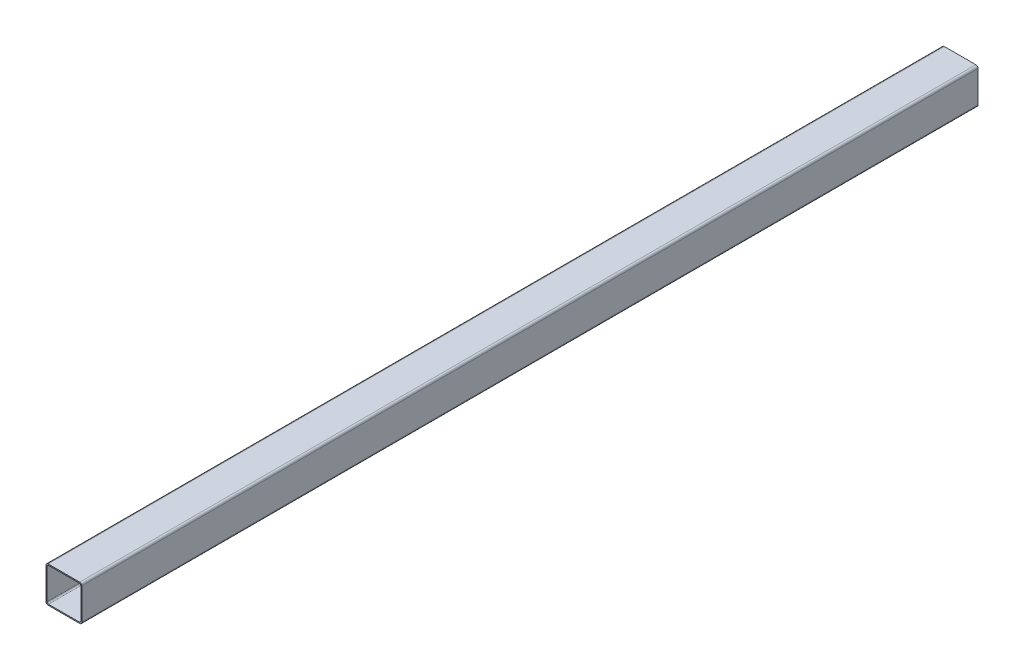
ISO-10303-21;
HEADER;
FILE_DESCRIPTION(('STEP AP214'),'2;1');
FILE_NAME('part.step','',(''),(''),'','','');
FILE_SCHEMA(('AUTOMOTIVE_DESIGN { 1 0 10303 214 1 1 1 1 }'));
ENDSEC;
DATA;
#1=APPLICATION_CONTEXT('core data for automotive mechanical design processes');
#2=APPLICATION_PROTOCOL_DEFINITION('international standard','automotive_design',2000,#1);
#3=PRODUCT_CONTEXT('',#1,'mechanical');
#4=PRODUCT('Part','Part','',(#3));
#5=PRODUCT_RELATED_PRODUCT_CATEGORY('part','',(#4));
#6=PRODUCT_DEFINITION_FORMATION('','',#4);
#7=PRODUCT_DEFINITION_CONTEXT('part definition',#1,'design');
#8=PRODUCT_DEFINITION('design','',#6,#7);
#9=PRODUCT_DEFINITION_SHAPE('','',#8);
#10=(LENGTH_UNIT() NAMED_UNIT(*) SI_UNIT(.MILLI.,.METRE.));
#11=(NAMED_UNIT(*) PLANE_ANGLE_UNIT() SI_UNIT($,.RADIAN.));
#12=(NAMED_UNIT(*) SI_UNIT($,.STERADIAN.) SOLID_ANGLE_UNIT());
#13=UNCERTAINTY_MEASURE_WITH_UNIT(LENGTH_MEASURE(1.E-05),#10,'distance_accuracy_value','');
#14=(GEOMETRIC_REPRESENTATION_CONTEXT(3) GLOBAL_UNCERTAINTY_ASSIGNED_CONTEXT((#13)) GLOBAL_UNIT_ASSIGNED_CONTEXT((#10,
#11,#12)) REPRESENTATION_CONTEXT('',''));
#15=CARTESIAN_POINT('',(0.,0.,0.));
#16=DIRECTION('',(0.,0.,1.));
#17=DIRECTION('',(1.,0.,0.));
#18=AXIS2_PLACEMENT_3D('',#15,#16,#17);
#19=CARTESIAN_POINT('',(-44.0000000000005,-43.9999999999965,-2500.));
#20=DIRECTION('',(0.,0.,1.));
#21=DIRECTION('',(1.,0.,0.));
#22=AXIS2_PLACEMENT_3D('',#19,#20,#21);
#23=CYLINDRICAL_SURFACE('',#22,6.00000000000014);
#24=CARTESIAN_POINT('',(-44.0000000000005,-43.9999999999965,0.));
#25=DIRECTION('',(0.,0.,1.));
#26=DIRECTION('',(1.,0.,0.));
#27=AXIS2_PLACEMENT_3D('',#24,#25,#26);
#28=CIRCLE('',#27,6.00000000000014);
#29=CARTESIAN_POINT('',(-50.0000000000007,-43.9999999999965,0.));
#30=VERTEX_POINT('',#29);
#31=CARTESIAN_POINT('',(-44.0000000000005,-49.9999999999966,0.));
#32=VERTEX_POINT('',#31);
#33=EDGE_CURVE('E204',#30,#32,#28,.T.);
#34=ORIENTED_EDGE('',*,*,#33,.F.);
#35=DIRECTION('',(0.,0.,1.));
#36=VECTOR('',#35,1.);
#37=CARTESIAN_POINT('',(-50.0000000000007,-43.9999999999965,-2500.));
#38=LINE('',#37,#36);
#39=CARTESIAN_POINT('',(-50.0000000000007,-43.9999999999965,-2500.));
#40=VERTEX_POINT('',#39);
#41=EDGE_CURVE('E11',#40,#30,#38,.T.);
#42=ORIENTED_EDGE('',*,*,#41,.F.);
#43=CARTESIAN_POINT('',(-44.0000000000005,-43.9999999999965,-2500.));
#44=DIRECTION('',(0.,0.,1.));
#45=DIRECTION('',(1.,0.,0.));
#46=AXIS2_PLACEMENT_3D('',#43,#44,#45);
#47=CIRCLE('',#46,6.00000000000014);
#48=CARTESIAN_POINT('',(-44.0000000000005,-49.9999999999966,-2500.));
#49=VERTEX_POINT('',#48);
#50=EDGE_CURVE('E216',#40,#49,#47,.T.);
#51=ORIENTED_EDGE('',*,*,#50,.T.);
#52=DIRECTION('',(0.,0.,1.));
#53=VECTOR('',#52,1.);
#54=CARTESIAN_POINT('',(-44.0000000000005,-49.9999999999966,-2500.));
#55=LINE('',#54,#53);
#56=EDGE_CURVE('E37',#49,#32,#55,.T.);
#57=ORIENTED_EDGE('',*,*,#56,.T.);
#58=EDGE_LOOP('',(#34,#42,#51,#57));
#59=FACE_BOUND('',#58,.T.);
#60=ADVANCED_FACE('F34',(#59),#23,.T.);
#61=CARTESIAN_POINT('',(-50.0000000000007,44.0000000000034,-2500.));
#62=DIRECTION('',(-1.,0.,0.));
#63=DIRECTION('',(0.,0.,1.));
#64=AXIS2_PLACEMENT_3D('',#61,#62,#63);
#65=PLANE('',#64);
#66=DIRECTION('',(0.,-1.,0.));
#67=VECTOR('',#66,1.);
#68=CARTESIAN_POINT('',(-50.0000000000007,44.0000000000034,0.));
#69=LINE('',#68,#67);
#70=CARTESIAN_POINT('',(-50.0000000000007,44.0000000000034,0.));
#71=VERTEX_POINT('',#70);
#72=EDGE_CURVE('E220',#71,#30,#69,.T.);
#73=ORIENTED_EDGE('',*,*,#72,.F.);
#74=DIRECTION('',(0.,0.,1.));
#75=VECTOR('',#74,1.);
#76=CARTESIAN_POINT('',(-50.0000000000007,44.0000000000034,-2500.));
#77=LINE('',#76,#75);
#78=CARTESIAN_POINT('',(-50.0000000000007,44.0000000000034,-2500.));
#79=VERTEX_POINT('',#78);
#80=EDGE_CURVE('E42',#79,#71,#77,.T.);
#81=ORIENTED_EDGE('',*,*,#80,.F.);
#82=DIRECTION('',(0.,-1.,0.));
#83=VECTOR('',#82,1.);
#84=CARTESIAN_POINT('',(-50.0000000000007,44.0000000000034,-2500.));
#85=LINE('',#84,#83);
#86=EDGE_CURVE('E238',#79,#40,#85,.T.);
#87=ORIENTED_EDGE('',*,*,#86,.T.);
#88=ORIENTED_EDGE('',*,*,#41,.T.);
#89=EDGE_LOOP('',(#73,#81,#87,#88));
#90=FACE_BOUND('',#89,.T.);
#91=ADVANCED_FACE('F285',(#90),#65,.T.);
#92=CARTESIAN_POINT('',(-44.0000000000005,44.0000000000034,-2500.));
#93=DIRECTION('',(0.,0.,1.));
#94=DIRECTION('',(1.,0.,0.));
#95=AXIS2_PLACEMENT_3D('',#92,#93,#94);
#96=CYLINDRICAL_SURFACE('',#95,6.00000000000014);
#97=CARTESIAN_POINT('',(-44.0000000000005,44.0000000000034,0.));
#98=DIRECTION('',(0.,0.,1.));
#99=DIRECTION('',(1.,0.,0.));
#100=AXIS2_PLACEMENT_3D('',#97,#98,#99);
#101=CIRCLE('',#100,6.00000000000014);
#102=CARTESIAN_POINT('',(-44.0000000000005,50.0000000000036,0.));
#103=VERTEX_POINT('',#102);
#104=EDGE_CURVE('E258',#103,#71,#101,.T.);
#105=ORIENTED_EDGE('',*,*,#104,.F.);
#106=DIRECTION('',(0.,0.,1.));
#107=VECTOR('',#106,1.);
#108=CARTESIAN_POINT('',(-44.0000000000005,50.0000000000036,-2500.));
#109=LINE('',#108,#107);
#110=CARTESIAN_POINT('',(-44.0000000000005,50.0000000000036,-2500.));
#111=VERTEX_POINT('',#110);
#112=EDGE_CURVE('E264',#111,#103,#109,.T.);
#113=ORIENTED_EDGE('',*,*,#112,.F.);
#114=CARTESIAN_POINT('',(-44.0000000000005,44.0000000000034,-2500.));
#115=DIRECTION('',(0.,0.,1.));
#116=DIRECTION('',(1.,0.,0.));
#117=AXIS2_PLACEMENT_3D('',#114,#115,#116);
#118=CIRCLE('',#117,6.00000000000014);
#119=EDGE_CURVE('E235',#111,#79,#118,.T.);
#120=ORIENTED_EDGE('',*,*,#119,.T.);
#121=ORIENTED_EDGE('',*,*,#80,.T.);
#122=EDGE_LOOP('',(#105,#113,#120,#121));
#123=FACE_BOUND('',#122,.T.);
#124=ADVANCED_FACE('F304',(#123),#96,.T.);
#125=CARTESIAN_POINT('',(-44.0000000000005,50.0000000000035,-2500.));
#126=DIRECTION('',(0.,1.,0.));
#127=DIRECTION('',(0.,0.,1.));
#128=AXIS2_PLACEMENT_3D('',#125,#126,#127);
#129=PLANE('',#128);
#130=DIRECTION('',(-1.,0.,0.));
#131=VECTOR('',#130,1.);
#132=CARTESIAN_POINT('',(-44.0000000000005,50.0000000000035,0.));
#133=LINE('',#132,#131);
#134=CARTESIAN_POINT('',(43.9999999999987,50.0000000000035,0.));
#135=VERTEX_POINT('',#134);
#136=EDGE_CURVE('E255',#135,#103,#133,.T.);
#137=ORIENTED_EDGE('',*,*,#136,.F.);
#138=DIRECTION('',(0.,0.,1.));
#139=VECTOR('',#138,1.);
#140=CARTESIAN_POINT('',(43.9999999999987,50.0000000000035,-2500.));
#141=LINE('',#140,#139);
#142=CARTESIAN_POINT('',(43.9999999999987,50.0000000000035,-2500.));
#143=VERTEX_POINT('',#142);
#144=EDGE_CURVE('E266',#143,#135,#141,.T.);
#145=ORIENTED_EDGE('',*,*,#144,.F.);
#146=DIRECTION('',(-1.,0.,0.));
#147=VECTOR('',#146,1.);
#148=CARTESIAN_POINT('',(-44.0000000000005,50.0000000000035,-2500.));
#149=LINE('',#148,#147);
#150=EDGE_CURVE('E232',#143,#111,#149,.T.);
#151=ORIENTED_EDGE('',*,*,#150,.T.);
#152=ORIENTED_EDGE('',*,*,#112,.T.);
#153=EDGE_LOOP('',(#137,#145,#151,#152));
#154=FACE_BOUND('',#153,.T.);
#155=ADVANCED_FACE('F302',(#154),#129,.T.);
#156=CARTESIAN_POINT('',(43.9999999999987,44.0000000000034,-2500.));
#157=DIRECTION('',(0.,0.,1.));
#158=DIRECTION('',(1.,0.,0.));
#159=AXIS2_PLACEMENT_3D('',#156,#157,#158);
#160=CYLINDRICAL_SURFACE('',#159,6.00000000000014);
#161=CARTESIAN_POINT('',(43.9999999999987,44.0000000000034,0.));
#162=DIRECTION('',(0.,0.,1.));
#163=DIRECTION('',(-1.,0.,0.));
#164=AXIS2_PLACEMENT_3D('',#161,#162,#163);
#165=CIRCLE('',#164,6.00000000000014);
#166=CARTESIAN_POINT('',(49.9999999999988,44.0000000000034,0.));
#167=VERTEX_POINT('',#166);
#168=EDGE_CURVE('E252',#167,#135,#165,.T.);
#169=ORIENTED_EDGE('',*,*,#168,.F.);
#170=DIRECTION('',(0.,0.,1.));
#171=VECTOR('',#170,1.);
#172=CARTESIAN_POINT('',(49.9999999999988,44.0000000000034,-2500.));
#173=LINE('',#172,#171);
#174=CARTESIAN_POINT('',(49.9999999999988,44.0000000000034,-2500.));
#175=VERTEX_POINT('',#174);
#176=EDGE_CURVE('E268',#175,#167,#173,.T.);
#177=ORIENTED_EDGE('',*,*,#176,.F.);
#178=CARTESIAN_POINT('',(43.9999999999987,44.0000000000034,-2500.));
#179=DIRECTION('',(0.,0.,1.));
#180=DIRECTION('',(-1.,0.,0.));
#181=AXIS2_PLACEMENT_3D('',#178,#179,#180);
#182=CIRCLE('',#181,6.00000000000014);
#183=EDGE_CURVE('E229',#175,#143,#182,.T.);
#184=ORIENTED_EDGE('',*,*,#183,.T.);
#185=ORIENTED_EDGE('',*,*,#144,.T.);
#186=EDGE_LOOP('',(#169,#177,#184,#185));
#187=FACE_BOUND('',#186,.T.);
#188=ADVANCED_FACE('F298',(#187),#160,.T.);
#189=CARTESIAN_POINT('',(49.9999999999989,44.0000000000034,-2500.));
#190=DIRECTION('',(1.,0.,0.));
#191=DIRECTION('',(0.,0.,-1.));
#192=AXIS2_PLACEMENT_3D('',#189,#190,#191);
#193=PLANE('',#192);
#194=DIRECTION('',(0.,1.,0.));
#195=VECTOR('',#194,1.);
#196=CARTESIAN_POINT('',(49.9999999999989,44.0000000000034,0.));
#197=LINE('',#196,#195);
#198=CARTESIAN_POINT('',(49.9999999999989,-43.9999999999965,0.));
#199=VERTEX_POINT('',#198);
#200=EDGE_CURVE('E249',#199,#167,#197,.T.);
#201=ORIENTED_EDGE('',*,*,#200,.F.);
#202=DIRECTION('',(0.,0.,1.));
#203=VECTOR('',#202,1.);
#204=CARTESIAN_POINT('',(49.9999999999989,-43.9999999999965,-2500.));
#205=LINE('',#204,#203);
#206=CARTESIAN_POINT('',(49.9999999999989,-43.9999999999965,-2500.));
#207=VERTEX_POINT('',#206);
#208=EDGE_CURVE('E270',#207,#199,#205,.T.);
#209=ORIENTED_EDGE('',*,*,#208,.F.);
#210=DIRECTION('',(0.,1.,0.));
#211=VECTOR('',#210,1.);
#212=CARTESIAN_POINT('',(49.9999999999989,44.0000000000034,-2500.));
#213=LINE('',#212,#211);
#214=EDGE_CURVE('E226',#207,#175,#213,.T.);
#215=ORIENTED_EDGE('',*,*,#214,.T.);
#216=ORIENTED_EDGE('',*,*,#176,.T.);
#217=EDGE_LOOP('',(#201,#209,#215,#216));
#218=FACE_BOUND('',#217,.T.);
#219=ADVANCED_FACE('F296',(#218),#193,.T.);
#220=CARTESIAN_POINT('',(43.9999999999987,-43.9999999999965,-2500.));
#221=DIRECTION('',(0.,0.,1.));
#222=DIRECTION('',(1.,0.,0.));
#223=AXIS2_PLACEMENT_3D('',#220,#221,#222);
#224=CYLINDRICAL_SURFACE('',#223,6.00000000000014);
#225=CARTESIAN_POINT('',(43.9999999999987,-43.9999999999965,0.));
#226=DIRECTION('',(0.,0.,1.));
#227=DIRECTION('',(1.,0.,0.));
#228=AXIS2_PLACEMENT_3D('',#225,#226,#227);
#229=CIRCLE('',#228,6.00000000000014);
#230=CARTESIAN_POINT('',(43.9999999999987,-49.9999999999967,0.));
#231=VERTEX_POINT('',#230);
#232=EDGE_CURVE('E246',#231,#199,#229,.T.);
#233=ORIENTED_EDGE('',*,*,#232,.F.);
#234=DIRECTION('',(0.,0.,1.));
#235=VECTOR('',#234,1.);
#236=CARTESIAN_POINT('',(43.9999999999987,-49.9999999999967,-2500.));
#237=LINE('',#236,#235);
#238=CARTESIAN_POINT('',(43.9999999999987,-49.9999999999967,-2500.));
#239=VERTEX_POINT('',#238);
#240=EDGE_CURVE('E271',#239,#231,#237,.T.);
#241=ORIENTED_EDGE('',*,*,#240,.F.);
#242=CARTESIAN_POINT('',(43.9999999999987,-43.9999999999965,-2500.));
#243=DIRECTION('',(0.,0.,1.));
#244=DIRECTION('',(1.,0.,0.));
#245=AXIS2_PLACEMENT_3D('',#242,#243,#244);
#246=CIRCLE('',#245,6.00000000000014);
#247=EDGE_CURVE('E223',#239,#207,#246,.T.);
#248=ORIENTED_EDGE('',*,*,#247,.T.);
#249=ORIENTED_EDGE('',*,*,#208,.T.);
#250=EDGE_LOOP('',(#233,#241,#248,#249));
#251=FACE_BOUND('',#250,.T.);
#252=ADVANCED_FACE('F292',(#251),#224,.T.);
#253=CARTESIAN_POINT('',(-44.0000000000005,-49.9999999999966,-2500.));
#254=DIRECTION('',(0.,-1.,0.));
#255=DIRECTION('',(0.,0.,-1.));
#256=AXIS2_PLACEMENT_3D('',#253,#254,#255);
#257=PLANE('',#256);
#258=DIRECTION('',(1.,0.,0.));
#259=VECTOR('',#258,1.);
#260=CARTESIAN_POINT('',(-44.0000000000005,-49.9999999999966,0.));
#261=LINE('',#260,#259);
#262=EDGE_CURVE('E243',#32,#231,#261,.T.);
#263=ORIENTED_EDGE('',*,*,#262,.F.);
#264=ORIENTED_EDGE('',*,*,#56,.F.);
#265=DIRECTION('',(1.,0.,0.));
#266=VECTOR('',#265,1.);
#267=CARTESIAN_POINT('',(-44.0000000000005,-49.9999999999966,-2500.));
#268=LINE('',#267,#266);
#269=EDGE_CURVE('E219',#49,#239,#268,.T.);
#270=ORIENTED_EDGE('',*,*,#269,.T.);
#271=ORIENTED_EDGE('',*,*,#240,.T.);
#272=EDGE_LOOP('',(#263,#264,#270,#271));
#273=FACE_BOUND('',#272,.T.);
#274=ADVANCED_FACE('F279',(#273),#257,.T.);
#275=CARTESIAN_POINT('',(-44.0000000000005,-43.9999999999965,-2500.));
#276=DIRECTION('',(0.,0.,1.));
#277=DIRECTION('',(1.,0.,0.));
#278=AXIS2_PLACEMENT_3D('',#275,#276,#277);
#279=PLANE('',#278);
#280=DIRECTION('',(0.,-1.,0.));
#281=VECTOR('',#280,1.);
#282=CARTESIAN_POINT('',(-47.0000000000009,43.0000000000035,-2500.));
#283=LINE('',#282,#281);
#284=CARTESIAN_POINT('',(-47.0000000000009,43.0000000000035,-2500.));
#285=VERTEX_POINT('',#284);
#286=CARTESIAN_POINT('',(-47.0000000000009,-42.9999999999966,-2500.));
#287=VERTEX_POINT('',#286);
#288=EDGE_CURVE('E155',#285,#287,#283,.T.);
#289=ORIENTED_EDGE('',*,*,#288,.T.);
#290=CARTESIAN_POINT('',(-43.0000000000009,-42.9999999999966,-2500.));
#291=DIRECTION('',(0.,0.,1.));
#292=DIRECTION('',(1.,0.,0.));
#293=AXIS2_PLACEMENT_3D('',#290,#291,#292);
#294=CIRCLE('',#293,4.);
#295=CARTESIAN_POINT('',(-43.0000000000009,-46.9999999999966,-2500.));
#296=VERTEX_POINT('',#295);
#297=EDGE_CURVE('E149',#287,#296,#294,.T.);
#298=ORIENTED_EDGE('',*,*,#297,.T.);
#299=DIRECTION('',(1.,0.,0.));
#300=VECTOR('',#299,1.);
#301=CARTESIAN_POINT('',(-43.0000000000009,-46.9999999999966,-2500.));
#302=LINE('',#301,#300);
#303=CARTESIAN_POINT('',(42.9999999999991,-46.9999999999966,-2500.));
#304=VERTEX_POINT('',#303);
#305=EDGE_CURVE('E158',#296,#304,#302,.T.);
#306=ORIENTED_EDGE('',*,*,#305,.T.);
#307=CARTESIAN_POINT('',(42.9999999999991,-42.9999999999966,-2500.));
#308=DIRECTION('',(0.,0.,1.));
#309=DIRECTION('',(1.,0.,0.));
#310=AXIS2_PLACEMENT_3D('',#307,#308,#309);
#311=CIRCLE('',#310,4.);
#312=CARTESIAN_POINT('',(46.9999999999991,-42.9999999999966,-2500.));
#313=VERTEX_POINT('',#312);
#314=EDGE_CURVE('E50',#304,#313,#311,.T.);
#315=ORIENTED_EDGE('',*,*,#314,.T.);
#316=DIRECTION('',(0.,1.,0.));
#317=VECTOR('',#316,1.);
#318=CARTESIAN_POINT('',(46.9999999999991,43.0000000000035,-2500.));
#319=LINE('',#318,#317);
#320=CARTESIAN_POINT('',(46.9999999999991,43.0000000000035,-2500.));
#321=VERTEX_POINT('',#320);
#322=EDGE_CURVE('E173',#313,#321,#319,.T.);
#323=ORIENTED_EDGE('',*,*,#322,.T.);
#324=CARTESIAN_POINT('',(42.9999999999991,43.0000000000035,-2500.));
#325=DIRECTION('',(0.,0.,1.));
#326=DIRECTION('',(-1.,0.,0.));
#327=AXIS2_PLACEMENT_3D('',#324,#325,#326);
#328=CIRCLE('',#327,4.);
#329=CARTESIAN_POINT('',(42.9999999999991,47.0000000000035,-2500.));
#330=VERTEX_POINT('',#329);
#331=EDGE_CURVE('E176',#321,#330,#328,.T.);
#332=ORIENTED_EDGE('',*,*,#331,.T.);
#333=DIRECTION('',(-1.,0.,0.));
#334=VECTOR('',#333,1.);
#335=CARTESIAN_POINT('',(-43.0000000000009,47.0000000000035,-2500.));
#336=LINE('',#335,#334);
#337=CARTESIAN_POINT('',(-43.0000000000009,47.0000000000035,-2500.));
#338=VERTEX_POINT('',#337);
#339=EDGE_CURVE('E179',#330,#338,#336,.T.);
#340=ORIENTED_EDGE('',*,*,#339,.T.);
#341=CARTESIAN_POINT('',(-43.0000000000009,43.0000000000035,-2500.));
#342=DIRECTION('',(0.,0.,1.));
#343=DIRECTION('',(1.,0.,0.));
#344=AXIS2_PLACEMENT_3D('',#341,#342,#343);
#345=CIRCLE('',#344,4.);
#346=EDGE_CURVE('E182',#338,#285,#345,.T.);
#347=ORIENTED_EDGE('',*,*,#346,.T.);
#348=EDGE_LOOP('',(#289,#298,#306,#315,#323,#332,#340,#347));
#349=FACE_BOUND('',#348,.T.);
#350=ORIENTED_EDGE('',*,*,#50,.F.);
#351=ORIENTED_EDGE('',*,*,#86,.F.);
#352=ORIENTED_EDGE('',*,*,#119,.F.);
#353=ORIENTED_EDGE('',*,*,#150,.F.);
#354=ORIENTED_EDGE('',*,*,#183,.F.);
#355=ORIENTED_EDGE('',*,*,#214,.F.);
#356=ORIENTED_EDGE('',*,*,#247,.F.);
#357=ORIENTED_EDGE('',*,*,#269,.F.);
#358=EDGE_LOOP('',(#350,#351,#352,#353,#354,#355,#356,#357));
#359=FACE_BOUND('',#358,.T.);
#360=ADVANCED_FACE('F162',(#349,#359),#279,.F.);
#361=CARTESIAN_POINT('',(-44.0000000000005,-43.9999999999965,0.));
#362=DIRECTION('',(0.,0.,1.));
#363=DIRECTION('',(1.,0.,0.));
#364=AXIS2_PLACEMENT_3D('',#361,#362,#363);
#365=PLANE('',#364);
#366=CARTESIAN_POINT('',(-43.0000000000009,-42.9999999999966,0.));
#367=DIRECTION('',(0.,0.,1.));
#368=DIRECTION('',(1.,0.,0.));
#369=AXIS2_PLACEMENT_3D('',#366,#367,#368);
#370=CIRCLE('',#369,4.);
#371=CARTESIAN_POINT('',(-47.0000000000009,-42.9999999999966,0.));
#372=VERTEX_POINT('',#371);
#373=CARTESIAN_POINT('',(-43.0000000000009,-46.9999999999966,0.));
#374=VERTEX_POINT('',#373);
#375=EDGE_CURVE('E58',#372,#374,#370,.T.);
#376=ORIENTED_EDGE('',*,*,#375,.F.);
#377=DIRECTION('',(0.,-1.,0.));
#378=VECTOR('',#377,1.);
#379=CARTESIAN_POINT('',(-47.0000000000009,43.0000000000035,0.));
#380=LINE('',#379,#378);
#381=CARTESIAN_POINT('',(-47.0000000000009,43.0000000000035,0.));
#382=VERTEX_POINT('',#381);
#383=EDGE_CURVE('E166',#382,#372,#380,.T.);
#384=ORIENTED_EDGE('',*,*,#383,.F.);
#385=CARTESIAN_POINT('',(-43.0000000000009,43.0000000000035,0.));
#386=DIRECTION('',(0.,0.,1.));
#387=DIRECTION('',(1.,0.,0.));
#388=AXIS2_PLACEMENT_3D('',#385,#386,#387);
#389=CIRCLE('',#388,4.);
#390=CARTESIAN_POINT('',(-43.0000000000009,47.0000000000035,0.));
#391=VERTEX_POINT('',#390);
#392=EDGE_CURVE('E169',#391,#382,#389,.T.);
#393=ORIENTED_EDGE('',*,*,#392,.F.);
#394=DIRECTION('',(-1.,0.,0.));
#395=VECTOR('',#394,1.);
#396=CARTESIAN_POINT('',(-43.0000000000009,47.0000000000035,0.));
#397=LINE('',#396,#395);
#398=CARTESIAN_POINT('',(42.9999999999991,47.0000000000035,0.));
#399=VERTEX_POINT('',#398);
#400=EDGE_CURVE('E197',#399,#391,#397,.T.);
#401=ORIENTED_EDGE('',*,*,#400,.F.);
#402=CARTESIAN_POINT('',(42.9999999999991,43.0000000000035,0.));
#403=DIRECTION('',(0.,0.,1.));
#404=DIRECTION('',(-1.,0.,0.));
#405=AXIS2_PLACEMENT_3D('',#402,#403,#404);
#406=CIRCLE('',#405,4.);
#407=CARTESIAN_POINT('',(46.9999999999991,43.0000000000035,0.));
#408=VERTEX_POINT('',#407);
#409=EDGE_CURVE('E194',#408,#399,#406,.T.);
#410=ORIENTED_EDGE('',*,*,#409,.F.);
#411=DIRECTION('',(0.,1.,0.));
#412=VECTOR('',#411,1.);
#413=CARTESIAN_POINT('',(46.9999999999991,43.0000000000035,0.));
#414=LINE('',#413,#412);
#415=CARTESIAN_POINT('',(46.9999999999991,-42.9999999999966,0.));
#416=VERTEX_POINT('',#415);
#417=EDGE_CURVE('E191',#416,#408,#414,.T.);
#418=ORIENTED_EDGE('',*,*,#417,.F.);
#419=CARTESIAN_POINT('',(42.9999999999991,-42.9999999999966,0.));
#420=DIRECTION('',(0.,0.,1.));
#421=DIRECTION('',(1.,0.,0.));
#422=AXIS2_PLACEMENT_3D('',#419,#420,#421);
#423=CIRCLE('',#422,4.);
#424=CARTESIAN_POINT('',(42.9999999999991,-46.9999999999966,0.));
#425=VERTEX_POINT('',#424);
#426=EDGE_CURVE('E188',#425,#416,#423,.T.);
#427=ORIENTED_EDGE('',*,*,#426,.F.);
#428=DIRECTION('',(1.,0.,0.));
#429=VECTOR('',#428,1.);
#430=CARTESIAN_POINT('',(-43.0000000000009,-46.9999999999966,0.));
#431=LINE('',#430,#429);
#432=EDGE_CURVE('E186',#374,#425,#431,.T.);
#433=ORIENTED_EDGE('',*,*,#432,.F.);
#434=EDGE_LOOP('',(#376,#384,#393,#401,#410,#418,#427,#433));
#435=FACE_BOUND('',#434,.T.);
#436=ORIENTED_EDGE('',*,*,#33,.T.);
#437=ORIENTED_EDGE('',*,*,#262,.T.);
#438=ORIENTED_EDGE('',*,*,#232,.T.);
#439=ORIENTED_EDGE('',*,*,#200,.T.);
#440=ORIENTED_EDGE('',*,*,#168,.T.);
#441=ORIENTED_EDGE('',*,*,#136,.T.);
#442=ORIENTED_EDGE('',*,*,#104,.T.);
#443=ORIENTED_EDGE('',*,*,#72,.T.);
#444=EDGE_LOOP('',(#436,#437,#438,#439,#440,#441,#442,#443));
#445=FACE_BOUND('',#444,.T.);
#446=ADVANCED_FACE('F281',(#435,#445),#365,.T.);
#447=CARTESIAN_POINT('',(-43.0000000000009,-42.9999999999966,-2500.));
#448=DIRECTION('',(0.,0.,1.));
#449=DIRECTION('',(1.,0.,0.));
#450=AXIS2_PLACEMENT_3D('',#447,#448,#449);
#451=CYLINDRICAL_SURFACE('',#450,4.);
#452=ORIENTED_EDGE('',*,*,#375,.T.);
#453=DIRECTION('',(0.,0.,1.));
#454=VECTOR('',#453,1.);
#455=CARTESIAN_POINT('',(-43.0000000000009,-46.9999999999966,-2500.));
#456=LINE('',#455,#454);
#457=EDGE_CURVE('E145',#296,#374,#456,.T.);
#458=ORIENTED_EDGE('',*,*,#457,.F.);
#459=ORIENTED_EDGE('',*,*,#297,.F.);
#460=DIRECTION('',(0.,0.,1.));
#461=VECTOR('',#460,1.);
#462=CARTESIAN_POINT('',(-47.0000000000009,-42.9999999999966,-2500.));
#463=LINE('',#462,#461);
#464=EDGE_CURVE('E202',#287,#372,#463,.T.);
#465=ORIENTED_EDGE('',*,*,#464,.T.);
#466=EDGE_LOOP('',(#452,#458,#459,#465));
#467=FACE_BOUND('',#466,.T.);
#468=ADVANCED_FACE('F147',(#467),#451,.F.);
#469=CARTESIAN_POINT('',(-47.0000000000009,43.0000000000035,-2500.));
#470=DIRECTION('',(-1.,0.,0.));
#471=DIRECTION('',(0.,0.,1.));
#472=AXIS2_PLACEMENT_3D('',#469,#470,#471);
#473=PLANE('',#472);
#474=ORIENTED_EDGE('',*,*,#383,.T.);
#475=ORIENTED_EDGE('',*,*,#464,.F.);
#476=ORIENTED_EDGE('',*,*,#288,.F.);
#477=DIRECTION('',(0.,0.,1.));
#478=VECTOR('',#477,1.);
#479=CARTESIAN_POINT('',(-47.0000000000009,43.0000000000035,-2500.));
#480=LINE('',#479,#478);
#481=EDGE_CURVE('E205',#285,#382,#480,.T.);
#482=ORIENTED_EDGE('',*,*,#481,.T.);
#483=EDGE_LOOP('',(#474,#475,#476,#482));
#484=FACE_BOUND('',#483,.T.);
#485=ADVANCED_FACE('F387',(#484),#473,.F.);
#486=CARTESIAN_POINT('',(-43.0000000000009,43.0000000000035,-2500.));
#487=DIRECTION('',(0.,0.,1.));
#488=DIRECTION('',(1.,0.,0.));
#489=AXIS2_PLACEMENT_3D('',#486,#487,#488);
#490=CYLINDRICAL_SURFACE('',#489,4.);
#491=ORIENTED_EDGE('',*,*,#392,.T.);
#492=ORIENTED_EDGE('',*,*,#481,.F.);
#493=ORIENTED_EDGE('',*,*,#346,.F.);
#494=DIRECTION('',(0.,0.,1.));
#495=VECTOR('',#494,1.);
#496=CARTESIAN_POINT('',(-43.0000000000009,47.0000000000035,-2500.));
#497=LINE('',#496,#495);
#498=EDGE_CURVE('E207',#338,#391,#497,.T.);
#499=ORIENTED_EDGE('',*,*,#498,.T.);
#500=EDGE_LOOP('',(#491,#492,#493,#499));
#501=FACE_BOUND('',#500,.T.);
#502=ADVANCED_FACE('F396',(#501),#490,.F.);
#503=CARTESIAN_POINT('',(-43.0000000000009,47.0000000000035,-2500.));
#504=DIRECTION('',(0.,1.,0.));
#505=DIRECTION('',(0.,0.,1.));
#506=AXIS2_PLACEMENT_3D('',#503,#504,#505);
#507=PLANE('',#506);
#508=ORIENTED_EDGE('',*,*,#400,.T.);
#509=ORIENTED_EDGE('',*,*,#498,.F.);
#510=ORIENTED_EDGE('',*,*,#339,.F.);
#511=DIRECTION('',(0.,0.,1.));
#512=VECTOR('',#511,1.);
#513=CARTESIAN_POINT('',(42.9999999999991,47.0000000000035,-2500.));
#514=LINE('',#513,#512);
#515=EDGE_CURVE('E209',#330,#399,#514,.T.);
#516=ORIENTED_EDGE('',*,*,#515,.T.);
#517=EDGE_LOOP('',(#508,#509,#510,#516));
#518=FACE_BOUND('',#517,.T.);
#519=ADVANCED_FACE('F406',(#518),#507,.F.);
#520=CARTESIAN_POINT('',(42.9999999999991,43.0000000000035,-2500.));
#521=DIRECTION('',(0.,0.,1.));
#522=DIRECTION('',(1.,0.,0.));
#523=AXIS2_PLACEMENT_3D('',#520,#521,#522);
#524=CYLINDRICAL_SURFACE('',#523,4.);
#525=ORIENTED_EDGE('',*,*,#409,.T.);
#526=ORIENTED_EDGE('',*,*,#515,.F.);
#527=ORIENTED_EDGE('',*,*,#331,.F.);
#528=DIRECTION('',(0.,0.,1.));
#529=VECTOR('',#528,1.);
#530=CARTESIAN_POINT('',(46.9999999999991,43.0000000000035,-2500.));
#531=LINE('',#530,#529);
#532=EDGE_CURVE('E211',#321,#408,#531,.T.);
#533=ORIENTED_EDGE('',*,*,#532,.T.);
#534=EDGE_LOOP('',(#525,#526,#527,#533));
#535=FACE_BOUND('',#534,.T.);
#536=ADVANCED_FACE('F416',(#535),#524,.F.);
#537=CARTESIAN_POINT('',(46.9999999999991,43.0000000000035,-2500.));
#538=DIRECTION('',(1.,0.,0.));
#539=DIRECTION('',(0.,0.,-1.));
#540=AXIS2_PLACEMENT_3D('',#537,#538,#539);
#541=PLANE('',#540);
#542=ORIENTED_EDGE('',*,*,#417,.T.);
#543=ORIENTED_EDGE('',*,*,#532,.F.);
#544=ORIENTED_EDGE('',*,*,#322,.F.);
#545=DIRECTION('',(0.,0.,1.));
#546=VECTOR('',#545,1.);
#547=CARTESIAN_POINT('',(46.9999999999991,-42.9999999999966,-2500.));
#548=LINE('',#547,#546);
#549=EDGE_CURVE('E213',#313,#416,#548,.T.);
#550=ORIENTED_EDGE('',*,*,#549,.T.);
#551=EDGE_LOOP('',(#542,#543,#544,#550));
#552=FACE_BOUND('',#551,.T.);
#553=ADVANCED_FACE('F426',(#552),#541,.F.);
#554=CARTESIAN_POINT('',(42.9999999999991,-42.9999999999966,-2500.));
#555=DIRECTION('',(0.,0.,1.));
#556=DIRECTION('',(1.,0.,0.));
#557=AXIS2_PLACEMENT_3D('',#554,#555,#556);
#558=CYLINDRICAL_SURFACE('',#557,4.);
#559=ORIENTED_EDGE('',*,*,#426,.T.);
#560=ORIENTED_EDGE('',*,*,#549,.F.);
#561=ORIENTED_EDGE('',*,*,#314,.F.);
#562=DIRECTION('',(0.,0.,1.));
#563=VECTOR('',#562,1.);
#564=CARTESIAN_POINT('',(42.9999999999991,-46.9999999999966,-2500.));
#565=LINE('',#564,#563);
#566=EDGE_CURVE('E154',#304,#425,#565,.T.);
#567=ORIENTED_EDGE('',*,*,#566,.T.);
#568=EDGE_LOOP('',(#559,#560,#561,#567));
#569=FACE_BOUND('',#568,.T.);
#570=ADVANCED_FACE('F436',(#569),#558,.F.);
#571=CARTESIAN_POINT('',(-43.0000000000009,-46.9999999999966,-2500.));
#572=DIRECTION('',(0.,-1.,0.));
#573=DIRECTION('',(0.,0.,-1.));
#574=AXIS2_PLACEMENT_3D('',#571,#572,#573);
#575=PLANE('',#574);
#576=ORIENTED_EDGE('',*,*,#432,.T.);
#577=ORIENTED_EDGE('',*,*,#566,.F.);
#578=ORIENTED_EDGE('',*,*,#305,.F.);
#579=ORIENTED_EDGE('',*,*,#457,.T.);
#580=EDGE_LOOP('',(#576,#577,#578,#579));
#581=FACE_BOUND('',#580,.T.);
#582=ADVANCED_FACE('F159',(#581),#575,.F.);
#583=CLOSED_SHELL('',(#60,#91,#124,#155,#188,#219,#252,#274,#360,#446,#468,#485,#502,#519,#536,
#553,#570,#582));
#584=MANIFOLD_SOLID_BREP('B2',#583);
#585=ADVANCED_BREP_SHAPE_REPRESENTATION('',(#18,#584),#14);
#586=SHAPE_DEFINITION_REPRESENTATION(#9,#585);
ENDSEC;
END-ISO-10303-21;
